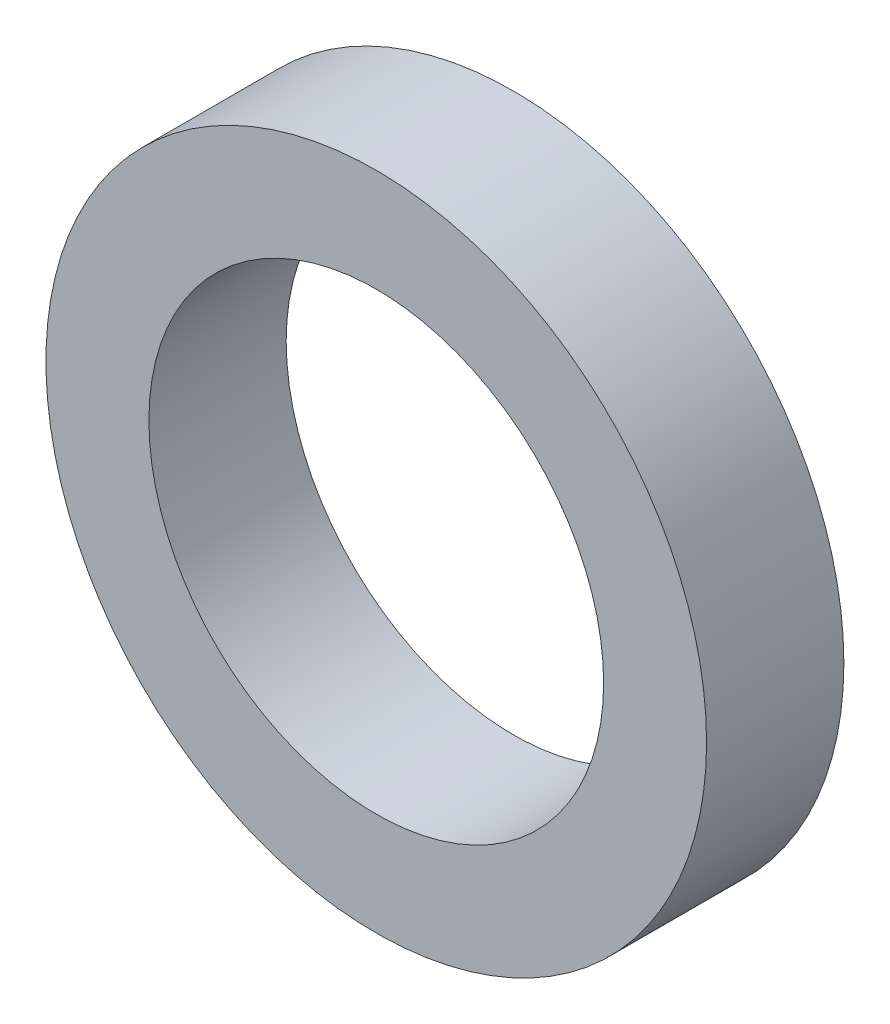
ISO-10303-21;
HEADER;
FILE_DESCRIPTION(('STEP AP214'),'2;1');
FILE_NAME('part.step','',(''),(''),'','','');
FILE_SCHEMA(('AUTOMOTIVE_DESIGN { 1 0 10303 214 1 1 1 1 }'));
ENDSEC;
DATA;
#1=APPLICATION_CONTEXT('core data for automotive mechanical design processes');
#2=APPLICATION_PROTOCOL_DEFINITION('international standard','automotive_design',2000,#1);
#3=PRODUCT_CONTEXT('',#1,'mechanical');
#4=PRODUCT('Part','Part','',(#3));
#5=PRODUCT_RELATED_PRODUCT_CATEGORY('part','',(#4));
#6=PRODUCT_DEFINITION_FORMATION('','',#4);
#7=PRODUCT_DEFINITION_CONTEXT('part definition',#1,'design');
#8=PRODUCT_DEFINITION('design','',#6,#7);
#9=PRODUCT_DEFINITION_SHAPE('','',#8);
#10=(LENGTH_UNIT() NAMED_UNIT(*) SI_UNIT(.MILLI.,.METRE.));
#11=(NAMED_UNIT(*) PLANE_ANGLE_UNIT() SI_UNIT($,.RADIAN.));
#12=(NAMED_UNIT(*) SI_UNIT($,.STERADIAN.) SOLID_ANGLE_UNIT());
#13=UNCERTAINTY_MEASURE_WITH_UNIT(LENGTH_MEASURE(1.E-05),#10,'distance_accuracy_value','');
#14=(GEOMETRIC_REPRESENTATION_CONTEXT(3) GLOBAL_UNCERTAINTY_ASSIGNED_CONTEXT((#13)) GLOBAL_UNIT_ASSIGNED_CONTEXT((#10,
#11,#12)) REPRESENTATION_CONTEXT('',''));
#15=CARTESIAN_POINT('',(0.,0.,0.));
#16=DIRECTION('',(0.,0.,1.));
#17=DIRECTION('',(1.,0.,0.));
#18=AXIS2_PLACEMENT_3D('',#15,#16,#17);
#19=CARTESIAN_POINT('',(0.,0.,1.6));
#20=DIRECTION('',(0.,0.,1.));
#21=DIRECTION('',(1.,0.,0.));
#22=AXIS2_PLACEMENT_3D('',#19,#20,#21);
#23=PLANE('',#22);
#24=CARTESIAN_POINT('',(0.,0.,1.6));
#25=DIRECTION('',(0.,0.,1.));
#26=DIRECTION('',(1.,0.,0.));
#27=AXIS2_PLACEMENT_3D('',#24,#25,#26);
#28=CIRCLE('',#27,3.85);
#29=CARTESIAN_POINT('',(3.85,0.,1.6));
#30=VERTEX_POINT('',#29);
#31=EDGE_CURVE('E10',#30,#30,#28,.T.);
#32=ORIENTED_EDGE('',*,*,#31,.T.);
#33=EDGE_LOOP('',(#32));
#34=FACE_BOUND('',#33,.T.);
#35=CARTESIAN_POINT('',(0.,0.,1.6));
#36=DIRECTION('',(0.,0.,1.));
#37=DIRECTION('',(1.,0.,0.));
#38=AXIS2_PLACEMENT_3D('',#35,#36,#37);
#39=CIRCLE('',#38,2.65);
#40=CARTESIAN_POINT('',(2.65,0.,1.6));
#41=VERTEX_POINT('',#40);
#42=EDGE_CURVE('E46',#41,#41,#39,.T.);
#43=ORIENTED_EDGE('',*,*,#42,.F.);
#44=EDGE_LOOP('',(#43));
#45=FACE_BOUND('',#44,.T.);
#46=ADVANCED_FACE('F35',(#34,#45),#23,.T.);
#47=CARTESIAN_POINT('',(0.,0.,0.));
#48=DIRECTION('',(0.,0.,1.));
#49=DIRECTION('',(1.,0.,0.));
#50=AXIS2_PLACEMENT_3D('',#47,#48,#49);
#51=PLANE('',#50);
#52=CARTESIAN_POINT('',(0.,0.,0.));
#53=DIRECTION('',(0.,0.,1.));
#54=DIRECTION('',(1.,0.,0.));
#55=AXIS2_PLACEMENT_3D('',#52,#53,#54);
#56=CIRCLE('',#55,3.85);
#57=CARTESIAN_POINT('',(3.85,0.,0.));
#58=VERTEX_POINT('',#57);
#59=EDGE_CURVE('E39',#58,#58,#56,.T.);
#60=ORIENTED_EDGE('',*,*,#59,.F.);
#61=EDGE_LOOP('',(#60));
#62=FACE_BOUND('',#61,.T.);
#63=CARTESIAN_POINT('',(0.,0.,0.));
#64=DIRECTION('',(0.,0.,1.));
#65=DIRECTION('',(1.,0.,0.));
#66=AXIS2_PLACEMENT_3D('',#63,#64,#65);
#67=CIRCLE('',#66,2.65);
#68=CARTESIAN_POINT('',(2.65,0.,0.));
#69=VERTEX_POINT('',#68);
#70=EDGE_CURVE('E48',#69,#69,#67,.T.);
#71=ORIENTED_EDGE('',*,*,#70,.T.);
#72=EDGE_LOOP('',(#71));
#73=FACE_BOUND('',#72,.T.);
#74=ADVANCED_FACE('F58',(#62,#73),#51,.F.);
#75=CARTESIAN_POINT('',(0.,0.,1.6));
#76=DIRECTION('',(0.,0.,-1.));
#77=DIRECTION('',(-1.,0.,0.));
#78=AXIS2_PLACEMENT_3D('',#75,#76,#77);
#79=CYLINDRICAL_SURFACE('',#78,3.85);
#80=ORIENTED_EDGE('',*,*,#31,.F.);
#81=EDGE_LOOP('',(#80));
#82=FACE_BOUND('',#81,.T.);
#83=ORIENTED_EDGE('',*,*,#59,.T.);
#84=EDGE_LOOP('',(#83));
#85=FACE_BOUND('',#84,.T.);
#86=ADVANCED_FACE('F37',(#82,#85),#79,.T.);
#87=CARTESIAN_POINT('',(0.,0.,1.6));
#88=DIRECTION('',(0.,0.,-1.));
#89=DIRECTION('',(-1.,0.,0.));
#90=AXIS2_PLACEMENT_3D('',#87,#88,#89);
#91=CYLINDRICAL_SURFACE('',#90,2.65);
#92=ORIENTED_EDGE('',*,*,#42,.T.);
#93=EDGE_LOOP('',(#92));
#94=FACE_BOUND('',#93,.T.);
#95=ORIENTED_EDGE('',*,*,#70,.F.);
#96=EDGE_LOOP('',(#95));
#97=FACE_BOUND('',#96,.T.);
#98=ADVANCED_FACE('F54',(#94,#97),#91,.F.);
#99=CLOSED_SHELL('',(#46,#74,#86,#98));
#100=MANIFOLD_SOLID_BREP('B2',#99);
#101=ADVANCED_BREP_SHAPE_REPRESENTATION('',(#18,#100),#14);
#102=SHAPE_DEFINITION_REPRESENTATION(#9,#101);
ENDSEC;
END-ISO-10303-21;
